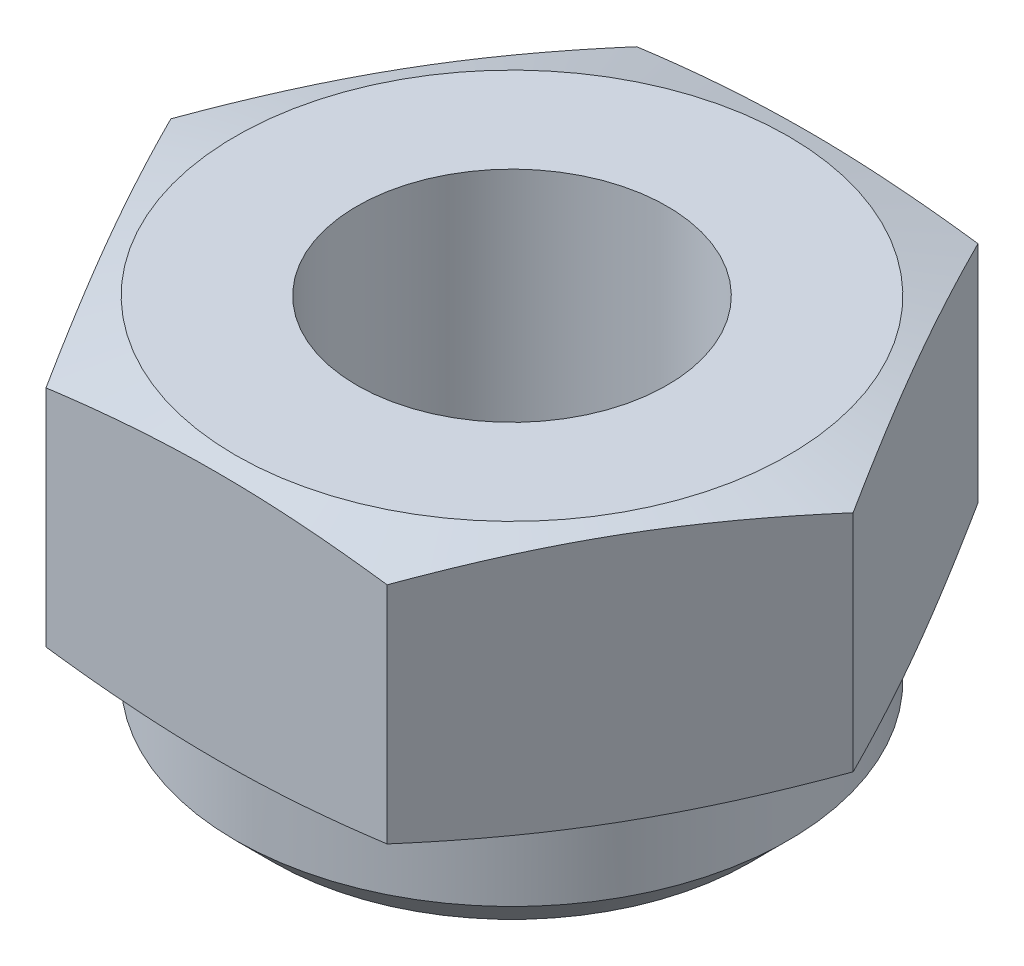
ISO-10303-21;
HEADER;
FILE_DESCRIPTION(('STEP AP214'),'2;1');
FILE_NAME('part.step','',(''),(''),'','','');
FILE_SCHEMA(('AUTOMOTIVE_DESIGN { 1 0 10303 214 1 1 1 1 }'));
ENDSEC;
DATA;
#1=APPLICATION_CONTEXT('core data for automotive mechanical design processes');
#2=APPLICATION_PROTOCOL_DEFINITION('international standard','automotive_design',2000,#1);
#3=PRODUCT_CONTEXT('',#1,'mechanical');
#4=PRODUCT('Part','Part','',(#3));
#5=PRODUCT_RELATED_PRODUCT_CATEGORY('part','',(#4));
#6=PRODUCT_DEFINITION_FORMATION('','',#4);
#7=PRODUCT_DEFINITION_CONTEXT('part definition',#1,'design');
#8=PRODUCT_DEFINITION('design','',#6,#7);
#9=PRODUCT_DEFINITION_SHAPE('','',#8);
#10=(LENGTH_UNIT() NAMED_UNIT(*) SI_UNIT(.MILLI.,.METRE.));
#11=(NAMED_UNIT(*) PLANE_ANGLE_UNIT() SI_UNIT($,.RADIAN.));
#12=(NAMED_UNIT(*) SI_UNIT($,.STERADIAN.) SOLID_ANGLE_UNIT());
#13=UNCERTAINTY_MEASURE_WITH_UNIT(LENGTH_MEASURE(1.E-05),#10,'distance_accuracy_value','');
#14=(GEOMETRIC_REPRESENTATION_CONTEXT(3) GLOBAL_UNCERTAINTY_ASSIGNED_CONTEXT((#13)) GLOBAL_UNIT_ASSIGNED_CONTEXT((#10,
#11,#12)) REPRESENTATION_CONTEXT('',''));
#15=CARTESIAN_POINT('',(0.,0.,0.));
#16=DIRECTION('',(0.,0.,1.));
#17=DIRECTION('',(1.,0.,0.));
#18=AXIS2_PLACEMENT_3D('',#15,#16,#17);
#19=CARTESIAN_POINT('',(0.,-3.22035730554475,0.));
#20=DIRECTION('',(0.,1.,0.));
#21=DIRECTION('',(0.,0.,1.));
#22=AXIS2_PLACEMENT_3D('',#19,#20,#21);
#23=CONICAL_SURFACE('',#22,4.55123435571671,1.30899693899575);
#24=CARTESIAN_POINT('',(0.,-3.453,0.));
#25=DIRECTION('',(0.,-1.,0.));
#26=DIRECTION('',(0.,0.,-1.));
#27=AXIS2_PLACEMENT_3D('',#24,#25,#26);
#28=CIRCLE('',#27,3.683);
#29=CARTESIAN_POINT('',(0.,-3.453,-3.68299999999999));
#30=VERTEX_POINT('',#29);
#31=EDGE_CURVE('E82',#30,#30,#28,.T.);
#32=ORIENTED_EDGE('',*,*,#31,.F.);
#33=EDGE_LOOP('',(#32));
#34=FACE_BOUND('',#33,.T.);
#35=CARTESIAN_POINT('',(-2.27302800979955,-3.2217448365256,-3.937));
#36=CARTESIAN_POINT('',(-2.36742116423181,-3.24704697845242,-3.77350626063663));
#37=CARTESIAN_POINT('',(-2.46198545378799,-3.27001707115095,-3.60971610654368));
#38=CARTESIAN_POINT('',(-2.65144796368359,-3.31037327653162,-3.28155741327498));
#39=CARTESIAN_POINT('',(-2.74634630386311,-3.32775712155993,-3.11718866653009));
#40=CARTESIAN_POINT('',(-2.93590160038181,-3.35592605718293,-2.78886926211592));
#41=CARTESIAN_POINT('',(-3.03055727520135,-3.3667447374092,-2.62492082410376));
#42=CARTESIAN_POINT('',(-3.2199893228459,-3.38125147171356,-2.29681489300159));
#43=CARTESIAN_POINT('',(-3.31476566877262,-3.38494090512249,-2.13265744650079));
#44=CARTESIAN_POINT('',(-3.50431836062605,-3.38494090512249,-1.8043425534992));
#45=CARTESIAN_POINT('',(-3.59909470655277,-3.38125147171356,-1.64018510699841));
#46=CARTESIAN_POINT('',(-3.78852675419732,-3.3667447374092,-1.31207917589623));
#47=CARTESIAN_POINT('',(-3.88318242901686,-3.35592605718293,-1.14813073788408));
#48=CARTESIAN_POINT('',(-4.07273772553556,-3.32775712155993,-0.8198113334699));
#49=CARTESIAN_POINT('',(-4.16763606571508,-3.31037327653162,-0.655442586725018));
#50=CARTESIAN_POINT('',(-4.35709857561068,-3.27001707115095,-0.327283893456316));
#51=CARTESIAN_POINT('',(-4.45166286516685,-3.24704697845242,-0.163493739363363));
#52=CARTESIAN_POINT('',(-4.54605601959911,-3.2217448365256,0.));
#53=B_SPLINE_CURVE_WITH_KNOTS('',3,(#35,#36,#37,#38,#39,#40,#41,#42,#43,#44,#45,#46,#47,#48,#49,
#50,#51,#52),.UNSPECIFIED.,.F.,.F.,(4,2,2,2,2,2,2,2,4),(0.,0.571452910592969,1.14313750178433,
1.71187194097368,2.28049633326033,2.84912072554698,3.41785516473633,3.98953975592769,
4.56099266652066),.UNSPECIFIED.);
#54=CARTESIAN_POINT('',(-2.27302800979955,-3.2217448365256,-3.937));
#55=VERTEX_POINT('',#54);
#56=CARTESIAN_POINT('',(-4.54605601959911,-3.2217448365256,0.));
#57=VERTEX_POINT('',#56);
#58=EDGE_CURVE('E105',#55,#57,#53,.T.);
#59=ORIENTED_EDGE('',*,*,#58,.F.);
#60=CARTESIAN_POINT('',(2.27302800979956,-3.22174483652559,-3.937));
#61=CARTESIAN_POINT('',(2.08424170093505,-3.24704697845242,-3.937));
#62=CARTESIAN_POINT('',(1.89511312182269,-3.27001707115095,-3.937));
#63=CARTESIAN_POINT('',(1.51618810203149,-3.31037327653162,-3.937));
#64=CARTESIAN_POINT('',(1.32639142167245,-3.32775712155993,-3.937));
#65=CARTESIAN_POINT('',(0.947280828635047,-3.35592605718293,-3.937));
#66=CARTESIAN_POINT('',(0.75796947899597,-3.3667447374092,-3.937));
#67=CARTESIAN_POINT('',(0.379105383706866,-3.38125147171356,-3.937));
#68=CARTESIAN_POINT('',(0.189552691853433,-3.38494090512249,-3.937));
#69=CARTESIAN_POINT('',(-0.189552691853431,-3.38494090512249,-3.937));
#70=CARTESIAN_POINT('',(-0.379105383706864,-3.38125147171356,-3.937));
#71=CARTESIAN_POINT('',(-0.757969478995967,-3.3667447374092,-3.937));
#72=CARTESIAN_POINT('',(-0.947280828635043,-3.35592605718293,-3.937));
#73=CARTESIAN_POINT('',(-1.32639142167245,-3.32775712155993,-3.937));
#74=CARTESIAN_POINT('',(-1.51618810203148,-3.31037327653162,-3.937));
#75=CARTESIAN_POINT('',(-1.89511312182269,-3.27001707115095,-3.937));
#76=CARTESIAN_POINT('',(-2.08424170093504,-3.24704697845242,-3.937));
#77=CARTESIAN_POINT('',(-2.27302800979955,-3.2217448365256,-3.937));
#78=B_SPLINE_CURVE_WITH_KNOTS('',3,(#60,#61,#62,#63,#64,#65,#66,#67,#68,#69,#70,#71,#72,#73,#74,
#75,#76,#77),.UNSPECIFIED.,.F.,.F.,(4,2,2,2,2,2,2,2,4),(0.,0.571452910592971,1.14313750178433,
1.71187194097368,2.28049633326034,2.84912072554699,3.41785516473634,3.9895397559277,
4.56099266652067),.UNSPECIFIED.);
#79=CARTESIAN_POINT('',(2.27302800979956,-3.22174483652559,-3.937));
#80=VERTEX_POINT('',#79);
#81=EDGE_CURVE('E109',#80,#55,#78,.T.);
#82=ORIENTED_EDGE('',*,*,#81,.F.);
#83=CARTESIAN_POINT('',(4.54605601959911,-3.2217448365256,0.));
#84=CARTESIAN_POINT('',(4.45166286516685,-3.24704697845242,-0.163493739363362));
#85=CARTESIAN_POINT('',(4.35709857561068,-3.27001707115095,-0.327283893456315));
#86=CARTESIAN_POINT('',(4.16763606571508,-3.31037327653162,-0.655442586725017));
#87=CARTESIAN_POINT('',(4.07273772553556,-3.32775712155993,-0.8198113334699));
#88=CARTESIAN_POINT('',(3.88318242901686,-3.35592605718293,-1.14813073788408));
#89=CARTESIAN_POINT('',(3.78852675419732,-3.3667447374092,-1.31207917589623));
#90=CARTESIAN_POINT('',(3.59909470655277,-3.38125147171356,-1.64018510699841));
#91=CARTESIAN_POINT('',(3.50431836062605,-3.38494090512249,-1.8043425534992));
#92=CARTESIAN_POINT('',(3.31476566877262,-3.38494090512249,-2.13265744650079));
#93=CARTESIAN_POINT('',(3.2199893228459,-3.38125147171356,-2.29681489300159));
#94=CARTESIAN_POINT('',(3.03055727520135,-3.3667447374092,-2.62492082410376));
#95=CARTESIAN_POINT('',(2.93590160038182,-3.35592605718293,-2.78886926211592));
#96=CARTESIAN_POINT('',(2.74634630386311,-3.32775712155993,-3.11718866653009));
#97=CARTESIAN_POINT('',(2.6514479636836,-3.31037327653162,-3.28155741327498));
#98=CARTESIAN_POINT('',(2.461985453788,-3.27001707115095,-3.60971610654368));
#99=CARTESIAN_POINT('',(2.36742116423182,-3.24704697845242,-3.77350626063663));
#100=CARTESIAN_POINT('',(2.27302800979956,-3.22174483652559,-3.937));
#101=B_SPLINE_CURVE_WITH_KNOTS('',3,(#83,#84,#85,#86,#87,#88,#89,#90,#91,#92,#93,#94,#95,#96,
#97,#98,#99,#100),.UNSPECIFIED.,.F.,.F.,(4,2,2,2,2,2,2,2,4),(0.,0.571452910592969,
1.14313750178433,1.71187194097368,2.28049633326033,2.84912072554698,3.41785516473633,
3.98953975592769,4.56099266652066),.UNSPECIFIED.);
#102=CARTESIAN_POINT('',(4.54605601959911,-3.2217448365256,0.));
#103=VERTEX_POINT('',#102);
#104=EDGE_CURVE('E88',#103,#80,#101,.T.);
#105=ORIENTED_EDGE('',*,*,#104,.F.);
#106=CARTESIAN_POINT('',(2.27302800979956,-3.2217448365256,3.937));
#107=CARTESIAN_POINT('',(2.36742116423182,-3.24704697845242,3.77350626063664));
#108=CARTESIAN_POINT('',(2.46198545378799,-3.27001707115095,3.60971610654368));
#109=CARTESIAN_POINT('',(2.65144796368359,-3.31037327653162,3.28155741327498));
#110=CARTESIAN_POINT('',(2.74634630386311,-3.32775712155993,3.1171886665301));
#111=CARTESIAN_POINT('',(2.93590160038181,-3.35592605718293,2.78886926211593));
#112=CARTESIAN_POINT('',(3.03055727520135,-3.3667447374092,2.62492082410377));
#113=CARTESIAN_POINT('',(3.2199893228459,-3.38125147171356,2.2968148930016));
#114=CARTESIAN_POINT('',(3.31476566877262,-3.38494090512249,2.1326574465008));
#115=CARTESIAN_POINT('',(3.50431836062605,-3.38494090512249,1.80434255349921));
#116=CARTESIAN_POINT('',(3.59909470655277,-3.38125147171356,1.64018510699841));
#117=CARTESIAN_POINT('',(3.78852675419732,-3.3667447374092,1.31207917589624));
#118=CARTESIAN_POINT('',(3.88318242901686,-3.35592605718293,1.14813073788408));
#119=CARTESIAN_POINT('',(4.07273772553556,-3.32775712155993,0.819811333469907));
#120=CARTESIAN_POINT('',(4.16763606571508,-3.31037327653162,0.655442586725025));
#121=CARTESIAN_POINT('',(4.35709857561068,-3.27001707115095,0.327283893456322));
#122=CARTESIAN_POINT('',(4.45166286516685,-3.24704697845242,0.163493739363369));
#123=CARTESIAN_POINT('',(4.54605601959911,-3.2217448365256,0.));
#124=B_SPLINE_CURVE_WITH_KNOTS('',3,(#106,#107,#108,#109,#110,#111,#112,#113,#114,#115,#116,
#117,#118,#119,#120,#121,#122,#123),.UNSPECIFIED.,.F.,.F.,(4,2,2,2,2,2,2,2,4),(0.,
0.571452910592969,1.14313750178433,1.71187194097368,2.28049633326033,2.84912072554698,
3.41785516473633,3.98953975592769,4.56099266652066),.UNSPECIFIED.);
#125=CARTESIAN_POINT('',(2.27302800979956,-3.2217448365256,3.937));
#126=VERTEX_POINT('',#125);
#127=EDGE_CURVE('E21',#126,#103,#124,.T.);
#128=ORIENTED_EDGE('',*,*,#127,.F.);
#129=CARTESIAN_POINT('',(-2.27302800979956,-3.2217448365256,3.937));
#130=CARTESIAN_POINT('',(-2.08424170093504,-3.24704697845242,3.937));
#131=CARTESIAN_POINT('',(-1.89511312182269,-3.27001707115095,3.937));
#132=CARTESIAN_POINT('',(-1.51618810203149,-3.31037327653162,3.937));
#133=CARTESIAN_POINT('',(-1.32639142167245,-3.32775712155993,3.937));
#134=CARTESIAN_POINT('',(-0.947280828635045,-3.35592605718293,3.937));
#135=CARTESIAN_POINT('',(-0.757969478995968,-3.3667447374092,3.937));
#136=CARTESIAN_POINT('',(-0.379105383706865,-3.38125147171356,3.937));
#137=CARTESIAN_POINT('',(-0.189552691853433,-3.38494090512249,3.937));
#138=CARTESIAN_POINT('',(0.189552691853432,-3.38494090512249,3.937));
#139=CARTESIAN_POINT('',(0.379105383706864,-3.38125147171356,3.937));
#140=CARTESIAN_POINT('',(0.757969478995968,-3.3667447374092,3.937));
#141=CARTESIAN_POINT('',(0.947280828635045,-3.35592605718293,3.937));
#142=CARTESIAN_POINT('',(1.32639142167245,-3.32775712155993,3.937));
#143=CARTESIAN_POINT('',(1.51618810203149,-3.31037327653162,3.937));
#144=CARTESIAN_POINT('',(1.89511312182269,-3.27001707115095,3.937));
#145=CARTESIAN_POINT('',(2.08424170093504,-3.24704697845242,3.937));
#146=CARTESIAN_POINT('',(2.27302800979956,-3.2217448365256,3.937));
#147=B_SPLINE_CURVE_WITH_KNOTS('',3,(#129,#130,#131,#132,#133,#134,#135,#136,#137,#138,#139,
#140,#141,#142,#143,#144,#145,#146),.UNSPECIFIED.,.F.,.F.,(4,2,2,2,2,2,2,2,4),(0.,
0.57145291059297,1.14313750178433,1.71187194097368,2.28049633326033,2.84912072554698,
3.41785516473634,3.9895397559277,4.56099266652067),.UNSPECIFIED.);
#148=CARTESIAN_POINT('',(-2.27302800979956,-3.2217448365256,3.937));
#149=VERTEX_POINT('',#148);
#150=EDGE_CURVE('E72',#149,#126,#147,.T.);
#151=ORIENTED_EDGE('',*,*,#150,.F.);
#152=CARTESIAN_POINT('',(-4.54605601959911,-3.2217448365256,0.));
#153=CARTESIAN_POINT('',(-4.45166286516686,-3.24704697845242,0.163493739363369));
#154=CARTESIAN_POINT('',(-4.35709857561068,-3.27001707115095,0.327283893456322));
#155=CARTESIAN_POINT('',(-4.16763606571508,-3.31037327653162,0.655442586725024));
#156=CARTESIAN_POINT('',(-4.07273772553556,-3.32775712155993,0.819811333469906));
#157=CARTESIAN_POINT('',(-3.88318242901686,-3.35592605718293,1.14813073788408));
#158=CARTESIAN_POINT('',(-3.78852675419732,-3.3667447374092,1.31207917589624));
#159=CARTESIAN_POINT('',(-3.59909470655277,-3.38125147171356,1.64018510699841));
#160=CARTESIAN_POINT('',(-3.50431836062605,-3.38494090512249,1.80434255349921));
#161=CARTESIAN_POINT('',(-3.31476566877262,-3.38494090512249,2.1326574465008));
#162=CARTESIAN_POINT('',(-3.2199893228459,-3.38125147171356,2.2968148930016));
#163=CARTESIAN_POINT('',(-3.03055727520135,-3.3667447374092,2.62492082410377));
#164=CARTESIAN_POINT('',(-2.93590160038181,-3.35592605718293,2.78886926211593));
#165=CARTESIAN_POINT('',(-2.74634630386311,-3.32775712155993,3.1171886665301));
#166=CARTESIAN_POINT('',(-2.65144796368359,-3.31037327653162,3.28155741327498));
#167=CARTESIAN_POINT('',(-2.46198545378799,-3.27001707115095,3.60971610654368));
#168=CARTESIAN_POINT('',(-2.36742116423181,-3.24704697845242,3.77350626063664));
#169=CARTESIAN_POINT('',(-2.27302800979956,-3.2217448365256,3.937));
#170=B_SPLINE_CURVE_WITH_KNOTS('',3,(#152,#153,#154,#155,#156,#157,#158,#159,#160,#161,#162,
#163,#164,#165,#166,#167,#168,#169),.UNSPECIFIED.,.F.,.F.,(4,2,2,2,2,2,2,2,4),(0.,
0.571452910592969,1.14313750178433,1.71187194097368,2.28049633326033,2.84912072554698,
3.41785516473633,3.98953975592769,4.56099266652066),.UNSPECIFIED.);
#171=EDGE_CURVE('E98',#57,#149,#170,.T.);
#172=ORIENTED_EDGE('',*,*,#171,.F.);
#173=EDGE_LOOP('',(#59,#82,#105,#128,#151,#172));
#174=FACE_BOUND('',#173,.T.);
#175=ADVANCED_FACE('F17',(#34,#174),#23,.T.);
#176=CARTESIAN_POINT('',(2.27302800979956,-4.953,3.937));
#177=DIRECTION('',(0.866025403784439,0.,0.499999999999999));
#178=DIRECTION('',(0.499999999999999,0.,-0.866025403784439));
#179=AXIS2_PLACEMENT_3D('',#176,#177,#178);
#180=PLANE('',#179);
#181=CARTESIAN_POINT('',(2.27302798691892,-0.231255169599825,3.93700003963043));
#182=CARTESIAN_POINT('',(2.3674211402546,-0.205953027587978,3.7735063021664));
#183=CARTESIAN_POINT('',(2.46198542870934,-0.182982934708705,3.60971614998118));
#184=CARTESIAN_POINT('',(2.65144793639823,-0.142626728752802,3.28155746053461));
#185=CARTESIAN_POINT('',(2.74634627547247,-0.12524288332993,3.11718871570413));
#186=CARTESIAN_POINT('',(2.93590156979769,-0.0970739466832135,2.78886931508919));
#187=CARTESIAN_POINT('',(3.03055724352903,-0.0862552658296005,2.62492087896183));
#188=CARTESIAN_POINT('',(3.21998928900921,-0.0717485300531823,2.29681495160846));
#189=CARTESIAN_POINT('',(3.31476563385975,-0.0680590957996024,2.13265750697166));
#190=CARTESIAN_POINT('',(3.50431832359237,-0.0680590939432748,1.80434261764342));
#191=CARTESIAN_POINT('',(3.59909466847445,-0.0717485263415443,1.64018517295199));
#192=CARTESIAN_POINT('',(3.7885267140491,-0.0862552585319696,1.31207924543499));
#193=CARTESIAN_POINT('',(3.88318238784338,-0.0970739376548731,1.14813080919863));
#194=CARTESIAN_POINT('',(4.07273768231352,-0.125242871043363,0.819811408332677));
#195=CARTESIAN_POINT('',(4.16763602146985,-0.142626714939716,0.655442663360006));
#196=CARTESIAN_POINT('',(4.35709852933456,-0.182982918081933,0.327283973608905));
#197=CARTESIAN_POINT('',(4.45166281788302,-0.205953009674135,0.163493821261367));
#198=CARTESIAN_POINT('',(4.54605597131061,-0.231255150530112,8.36381373183971E-08));
#199=B_SPLINE_CURVE_WITH_KNOTS('',3,(#181,#182,#183,#184,#185,#186,#187,#188,#189,#190,#191,
#192,#193,#194,#195,#196,#197,#198),.UNSPECIFIED.,.F.,.F.,(4,2,2,2,2,2,2,2,4),(0.,
0.571452904104339,1.14313748880532,1.7118719215906,2.28049630747671,2.84912069344121,
3.41785512630083,3.98953971106748,4.56099261525712),.UNSPECIFIED.);
#200=CARTESIAN_POINT('',(2.27302796148131,-0.231255156995559,3.937));
#201=VERTEX_POINT('',#200);
#202=CARTESIAN_POINT('',(4.54605599545448,-0.231255156999442,4.18197292350811E-08));
#203=VERTEX_POINT('',#202);
#204=EDGE_CURVE('E93',#201,#203,#199,.T.);
#205=ORIENTED_EDGE('',*,*,#204,.F.);
#206=DIRECTION('',(0.,1.,0.));
#207=VECTOR('',#206,1.);
#208=CARTESIAN_POINT('',(2.27302800979956,-4.953,3.937));
#209=LINE('',#208,#207);
#210=EDGE_CURVE('E77',#126,#201,#209,.T.);
#211=ORIENTED_EDGE('',*,*,#210,.F.);
#212=ORIENTED_EDGE('',*,*,#127,.T.);
#213=DIRECTION('',(0.,1.,0.));
#214=VECTOR('',#213,1.);
#215=CARTESIAN_POINT('',(4.54605601959911,-4.953,0.));
#216=LINE('',#215,#214);
#217=EDGE_CURVE('E110',#203,#103,#216,.F.);
#218=ORIENTED_EDGE('',*,*,#217,.F.);
#219=EDGE_LOOP('',(#205,#211,#212,#218));
#220=FACE_BOUND('',#219,.T.);
#221=ADVANCED_FACE('F92',(#220),#180,.T.);
#222=CARTESIAN_POINT('',(4.54605601959911,-4.953,0.));
#223=DIRECTION('',(0.866025403784439,0.,-0.499999999999999));
#224=DIRECTION('',(-0.499999999999999,0.,-0.866025403784439));
#225=AXIS2_PLACEMENT_3D('',#222,#223,#224);
#226=PLANE('',#225);
#227=CARTESIAN_POINT('',(4.54605604247459,-0.231255169598442,3.96214944871014E-08));
#228=CARTESIAN_POINT('',(4.45166288913996,-0.205953027586963,-0.163493697840718));
#229=CARTESIAN_POINT('',(4.35709860068627,-0.182982934708014,-0.327283850024111));
#230=CARTESIAN_POINT('',(4.1676360929995,-0.142626728752641,-0.655442539467011));
#231=CARTESIAN_POINT('',(4.07273775392633,-0.125242883329976,-0.819811284295649));
#232=CARTESIAN_POINT('',(3.88318245960322,-0.0970739466835187,-1.14813068490693));
#233=CARTESIAN_POINT('',(3.78852678587293,-0.0862552658299611,-1.31207912103246));
#234=CARTESIAN_POINT('',(3.59909474039486,-0.071748530053487,-1.64018504838219));
#235=CARTESIAN_POINT('',(3.50431839554537,-0.068059095799796,-1.80434249301717));
#236=CARTESIAN_POINT('',(3.31476570581485,-0.0680590939430812,-2.13265738234176));
#237=CARTESIAN_POINT('',(3.21998936093382,-0.0717485263410751,-2.29681482703139));
#238=CARTESIAN_POINT('',(3.03055731536126,-0.0862552585308086,-2.62492075454477));
#239=CARTESIAN_POINT('',(2.93590164156802,-0.0970739376532962,-2.78886919077932));
#240=CARTESIAN_POINT('',(2.74634634709997,-0.125242871040847,-3.11718859164167));
#241=CARTESIAN_POINT('',(2.65144800794468,-0.142626714936675,-3.28155733661253));
#242=CARTESIAN_POINT('',(2.46198550008205,-0.182982918077776,-3.60971602636003));
#243=CARTESIAN_POINT('',(2.36742121153462,-0.205953009669385,-3.77350617870577));
#244=CARTESIAN_POINT('',(2.27302805810806,-0.231255150524753,-3.93699991632722));
#245=B_SPLINE_CURVE_WITH_KNOTS('',3,(#227,#228,#229,#230,#231,#232,#233,#234,#235,#236,#237,
#238,#239,#240,#241,#242,#243,#244),.UNSPECIFIED.,.F.,.F.,(4,2,2,2,2,2,2,2,4),(0.,
0.571452904097947,1.14313748879253,1.71187192157149,2.28049630745129,2.84912069340951,
3.41785512626283,3.98953971102309,4.56099261520636),.UNSPECIFIED.);
#246=CARTESIAN_POINT('',(2.27302803395381,-0.231255156996865,-3.93699995816361));
#247=VERTEX_POINT('',#246);
#248=EDGE_CURVE('E190',#203,#247,#245,.T.);
#249=ORIENTED_EDGE('',*,*,#248,.F.);
#250=ORIENTED_EDGE('',*,*,#217,.T.);
#251=ORIENTED_EDGE('',*,*,#104,.T.);
#252=DIRECTION('',(0.,1.,0.));
#253=VECTOR('',#252,1.);
#254=CARTESIAN_POINT('',(2.27302800979956,-4.953,-3.937));
#255=LINE('',#254,#253);
#256=EDGE_CURVE('E106',#247,#80,#255,.F.);
#257=ORIENTED_EDGE('',*,*,#256,.F.);
#258=EDGE_LOOP('',(#249,#250,#251,#257));
#259=FACE_BOUND('',#258,.T.);
#260=ADVANCED_FACE('F195',(#259),#226,.T.);
#261=CARTESIAN_POINT('',(2.27302800979956,-4.953,-3.937));
#262=DIRECTION('',(0.,0.,-1.));
#263=DIRECTION('',(-1.,0.,0.));
#264=AXIS2_PLACEMENT_3D('',#261,#262,#263);
#265=PLANE('',#264);
#266=ORIENTED_EDGE('',*,*,#256,.T.);
#267=ORIENTED_EDGE('',*,*,#81,.T.);
#268=DIRECTION('',(0.,1.,0.));
#269=VECTOR('',#268,1.);
#270=CARTESIAN_POINT('',(-2.27302800979955,-4.953,-3.937));
#271=LINE('',#270,#269);
#272=CARTESIAN_POINT('',(-2.27302796148194,-0.231255156995643,-3.937));
#273=VERTEX_POINT('',#272);
#274=EDGE_CURVE('E102',#273,#55,#271,.F.);
#275=ORIENTED_EDGE('',*,*,#274,.F.);
#276=CARTESIAN_POINT('',(2.27302805554133,-0.231255169597212,-3.937));
#277=CARTESIAN_POINT('',(2.08424174290425,-0.20595302678314,-3.93700000000118));
#278=CARTESIAN_POINT('',(1.89511316000505,-0.182982933252794,-3.93700000000059));
#279=CARTESIAN_POINT('',(1.51618813260676,-0.142626726377202,-3.93699999999941));
#280=CARTESIAN_POINT('',(1.32639144842745,-0.125242880685982,-3.93699999999881));
#281=CARTESIAN_POINT('',(0.947280847754391,-0.0970739439694403,-3.93700000000117));
#282=CARTESIAN_POINT('',(0.757969494300103,-0.0862552633109423,-3.9370000000041));
#283=CARTESIAN_POINT('',(0.379105391365754,-0.0717485284336597,-3.93699999999589));
#284=CARTESIAN_POINT('',(0.189552695682294,-0.0680590948839046,-3.93699999998475));
#285=CARTESIAN_POINT('',(-0.189552683776927,-0.0680590948823656,-3.93699999998475));
#286=CARTESIAN_POINT('',(-0.379105367552687,-0.0717485279671321,-3.93699999999589));
#287=CARTESIAN_POINT('',(-0.757969446715473,-0.0862552610431552,-3.9370000000041));
#288=CARTESIAN_POINT('',(-0.947280788305919,-0.0970739403649571,-3.93700000000117));
#289=CARTESIAN_POINT('',(-1.32639136521005,-0.12524287368538,-3.93699999999881));
#290=CARTESIAN_POINT('',(-1.51618803748488,-0.142626717311309,-3.93699999999941));
#291=CARTESIAN_POINT('',(-1.89511304118042,-0.182982919529432,-3.93700000000059));
#292=CARTESIAN_POINT('',(-2.08424161228126,-0.205953010468246,-3.93700000000118));
#293=CARTESIAN_POINT('',(-2.27302791316432,-0.23125515052231,-3.937));
#294=B_SPLINE_CURVE_WITH_KNOTS('',3,(#276,#277,#278,#279,#280,#281,#282,#283,#284,#285,#286,
#287,#288,#289,#290,#291,#292,#293),.UNSPECIFIED.,.F.,.F.,(4,2,2,2,2,2,2,2,4),(0.,
0.571452922166741,1.14313752494876,1.71187197563215,2.28049637940514,2.84912074746415,
3.41785516240618,3.98953972907054,4.56099261517826),.UNSPECIFIED.);
#295=EDGE_CURVE('E186',#247,#273,#294,.T.);
#296=ORIENTED_EDGE('',*,*,#295,.F.);
#297=EDGE_LOOP('',(#266,#267,#275,#296));
#298=FACE_BOUND('',#297,.T.);
#299=ADVANCED_FACE('F177',(#298),#265,.T.);
#300=CARTESIAN_POINT('',(-2.27302800979955,-4.953,-3.937));
#301=DIRECTION('',(-0.866025403784439,0.,-0.5));
#302=DIRECTION('',(-0.5,0.,0.866025403784439));
#303=AXIS2_PLACEMENT_3D('',#300,#301,#302);
#304=PLANE('',#303);
#305=CARTESIAN_POINT('',(-2.27302798691955,-0.231255169599654,-3.93700003962932));
#306=CARTESIAN_POINT('',(-2.3674211402543,-0.205953027588066,-3.7735063021669));
#307=CARTESIAN_POINT('',(-2.46198542870812,-0.182982934709008,-3.60971614998329));
#308=CARTESIAN_POINT('',(-2.65144793639514,-0.142626728753416,-3.28155746053996));
#309=CARTESIAN_POINT('',(-2.74634627546844,-0.125242883330642,-3.11718871571111));
#310=CARTESIAN_POINT('',(-2.93590156979179,-0.0970739466839748,-2.78886931509939));
#311=CARTESIAN_POINT('',(-3.03055724352221,-0.0862552658303155,-2.62492087897365));
#312=CARTESIAN_POINT('',(-3.21998928900053,-0.0717485300536518,-2.29681495162349));
#313=CARTESIAN_POINT('',(-3.31476563385015,-0.0680590957998729,-2.13265750698829));
#314=CARTESIAN_POINT('',(-3.50431832358092,-0.0680590939430021,-1.80434261766325));
#315=CARTESIAN_POINT('',(-3.59909466846208,-0.0717485263409278,-1.6401851729734));
#316=CARTESIAN_POINT('',(-3.78852671403491,-0.086255258530549,-1.31207924545957));
#317=CARTESIAN_POINT('',(-3.88318238782827,-0.0970739376529923,-1.14813080922479));
#318=CARTESIAN_POINT('',(-4.07273768229659,-0.125242871040479,-0.819811408361994));
#319=CARTESIAN_POINT('',(-4.16763602145201,-0.142626714936288,-0.655442663390905));
#320=CARTESIAN_POINT('',(-4.3570985293149,-0.18298291807737,-0.327283973642951));
#321=CARTESIAN_POINT('',(-4.45166281786246,-0.205953009668981,-0.163493821296978));
#322=CARTESIAN_POINT('',(-4.54605597128915,-0.23125515052436,-8.36753081664675E-08));
#323=B_SPLINE_CURVE_WITH_KNOTS('',3,(#305,#306,#307,#308,#309,#310,#311,#312,#313,#314,#315,
#316,#317,#318,#319,#320,#321,#322),.UNSPECIFIED.,.F.,.F.,(4,2,2,2,2,2,2,2,4),(0.,
0.57145290409872,1.14313748879408,1.7118719215738,2.28049630745437,2.84912069341335,
3.41785512626745,3.98953971102849,4.56099261521254),.UNSPECIFIED.);
#324=CARTESIAN_POINT('',(-4.54605599544413,-0.231255156996668,-4.18376520402527E-08));
#325=VERTEX_POINT('',#324);
#326=EDGE_CURVE('E181',#273,#325,#323,.T.);
#327=ORIENTED_EDGE('',*,*,#326,.F.);
#328=ORIENTED_EDGE('',*,*,#274,.T.);
#329=ORIENTED_EDGE('',*,*,#58,.T.);
#330=DIRECTION('',(0.,1.,0.));
#331=VECTOR('',#330,1.);
#332=CARTESIAN_POINT('',(-4.54605601959911,-4.953,0.));
#333=LINE('',#332,#331);
#334=EDGE_CURVE('E94',#325,#57,#333,.F.);
#335=ORIENTED_EDGE('',*,*,#334,.F.);
#336=EDGE_LOOP('',(#327,#328,#329,#335));
#337=FACE_BOUND('',#336,.T.);
#338=ADVANCED_FACE('F174',(#337),#304,.T.);
#339=CARTESIAN_POINT('',(-4.54605601959911,-4.953,0.));
#340=DIRECTION('',(-0.866025403784439,0.,0.5));
#341=DIRECTION('',(0.5,0.,0.866025403784439));
#342=AXIS2_PLACEMENT_3D('',#339,#340,#341);
#343=PLANE('',#342);
#344=CARTESIAN_POINT('',(-4.54605604247146,-0.231255169597603,-3.96160681526264E-08));
#345=CARTESIAN_POINT('',(-4.45166288913672,-0.205953027586144,0.16349369784635));
#346=CARTESIAN_POINT('',(-4.3570986006829,-0.182982934707227,0.32728385002995));
#347=CARTESIAN_POINT('',(-4.16763609299589,-0.142626728751942,0.655442539473265));
#348=CARTESIAN_POINT('',(-4.0727377539226,-0.125242883329333,0.81981128430211));
#349=CARTESIAN_POINT('',(-3.88318245959926,-0.0970739466830166,1.14813068491381));
#350=CARTESIAN_POINT('',(-3.78852678586885,-0.0862552658295426,1.31207912103954));
#351=CARTESIAN_POINT('',(-3.59909474039054,-0.0717485300532604,1.64018504838967));
#352=CARTESIAN_POINT('',(-3.50431839554094,-0.0680590957996777,1.80434249302485));
#353=CARTESIAN_POINT('',(-3.31476570581019,-0.0680590939431978,2.13265738234984));
#354=CARTESIAN_POINT('',(-3.21998936092904,-0.071748526341318,2.29681482703966));
#355=CARTESIAN_POINT('',(-3.03055731535626,-0.0862552585313126,2.62492075455343));
#356=CARTESIAN_POINT('',(-2.93590164156291,-0.0970739376539349,2.78886919078817));
#357=CARTESIAN_POINT('',(-2.74634634709464,-0.125242871041757,3.1171885916509));
#358=CARTESIAN_POINT('',(-2.65144800793924,-0.142626714937722,3.28155733662195));
#359=CARTESIAN_POINT('',(-2.46198550007639,-0.18298291807909,3.60971602636982));
#360=CARTESIAN_POINT('',(-2.36742121152886,-0.20595300967083,3.77350617871576));
#361=CARTESIAN_POINT('',(-2.27302805810219,-0.231255150526325,3.93699991633739));
#362=B_SPLINE_CURVE_WITH_KNOTS('',3,(#344,#345,#346,#347,#348,#349,#350,#351,#352,#353,#354,
#355,#356,#357,#358,#359,#360,#361),.UNSPECIFIED.,.F.,.F.,(4,2,2,2,2,2,2,2,4),(0.,
0.571452904098646,1.14313748879393,1.71187192157358,2.28049630745407,2.84912069341297,
3.41785512626698,3.98953971102792,4.56099261521189),.UNSPECIFIED.);
#363=CARTESIAN_POINT('',(-2.27302803395087,-0.23125515699765,3.93699995816869));
#364=VERTEX_POINT('',#363);
#365=EDGE_CURVE('E40',#325,#364,#362,.T.);
#366=ORIENTED_EDGE('',*,*,#365,.F.);
#367=ORIENTED_EDGE('',*,*,#334,.T.);
#368=ORIENTED_EDGE('',*,*,#171,.T.);
#369=DIRECTION('',(0.,1.,0.));
#370=VECTOR('',#369,1.);
#371=CARTESIAN_POINT('',(-2.27302800979956,-4.953,3.937));
#372=LINE('',#371,#370);
#373=EDGE_CURVE('E79',#364,#149,#372,.F.);
#374=ORIENTED_EDGE('',*,*,#373,.F.);
#375=EDGE_LOOP('',(#366,#367,#368,#374));
#376=FACE_BOUND('',#375,.T.);
#377=ADVANCED_FACE('F142',(#376),#343,.T.);
#378=CARTESIAN_POINT('',(-2.27302800979956,-4.953,3.937));
#379=DIRECTION('',(0.,0.,1.));
#380=DIRECTION('',(1.,0.,0.));
#381=AXIS2_PLACEMENT_3D('',#378,#379,#380);
#382=PLANE('',#381);
#383=ORIENTED_EDGE('',*,*,#373,.T.);
#384=ORIENTED_EDGE('',*,*,#150,.T.);
#385=ORIENTED_EDGE('',*,*,#210,.T.);
#386=CARTESIAN_POINT('',(-2.2730280555296,-0.23125516959564,3.937));
#387=CARTESIAN_POINT('',(-2.08424174289363,-0.205953026782723,3.937));
#388=CARTESIAN_POINT('',(-1.89511315999558,-0.182982933252155,3.937));
#389=CARTESIAN_POINT('',(-1.5161881325993,-0.142626726376037,3.937));
#390=CARTESIAN_POINT('',(-1.32639144842086,-0.12524288068452,3.937));
#391=CARTESIAN_POINT('',(-0.947280847749753,-0.0970739439700641,3.937));
#392=CARTESIAN_POINT('',(-0.757969494296548,-0.0862552633139278,3.937));
#393=CARTESIAN_POINT('',(-0.379105391364629,-0.0717485284304964,3.937));
#394=CARTESIAN_POINT('',(-0.189552695682515,-0.0680590948722277,3.937));
#395=CARTESIAN_POINT('',(0.18955268377515,-0.0680590948706485,3.937));
#396=CARTESIAN_POINT('',(0.3791053675507,-0.0717485279639326,3.937));
#397=CARTESIAN_POINT('',(0.757969446713327,-0.0862552610461981,3.937));
#398=CARTESIAN_POINT('',(0.947280788303822,-0.0970739403657283,3.937));
#399=CARTESIAN_POINT('',(1.32639136520828,-0.125242873684318,3.937));
#400=CARTESIAN_POINT('',(1.51618803748337,-0.142626717310708,3.937));
#401=CARTESIAN_POINT('',(1.89511304117917,-0.18298291952974,3.937));
#402=CARTESIAN_POINT('',(2.08424161227999,-0.205953010468995,3.937));
#403=CARTESIAN_POINT('',(2.27302791316306,-0.231255150522141,3.937));
#404=B_SPLINE_CURVE_WITH_KNOTS('',3,(#386,#387,#388,#389,#390,#391,#392,#393,#394,#395,#396,
#397,#398,#399,#400,#401,#402,#403),.UNSPECIFIED.,.F.,.F.,(4,2,2,2,2,2,2,2,4),(0.,
0.571452922163274,1.14313752494267,1.71187197562272,2.28049637939196,2.84912074745062,
3.41785516239273,3.9895397290579,4.56099261516559),.UNSPECIFIED.);
#405=EDGE_CURVE('E123',#364,#201,#404,.T.);
#406=ORIENTED_EDGE('',*,*,#405,.F.);
#407=EDGE_LOOP('',(#383,#384,#385,#406));
#408=FACE_BOUND('',#407,.T.);
#409=ADVANCED_FACE('F74',(#408),#382,.T.);
#410=CARTESIAN_POINT('',(0.,-60.,0.));
#411=DIRECTION('',(0.,-1.,0.));
#412=DIRECTION('',(0.,0.,-1.));
#413=AXIS2_PLACEMENT_3D('',#410,#411,#412);
#414=CYLINDRICAL_SURFACE('',#413,3.683);
#415=ORIENTED_EDGE('',*,*,#31,.T.);
#416=EDGE_LOOP('',(#415));
#417=FACE_BOUND('',#416,.T.);
#418=CARTESIAN_POINT('',(0.,-4.44500000003245,0.));
#419=DIRECTION('',(0.,1.,0.));
#420=DIRECTION('',(0.,0.,1.));
#421=AXIS2_PLACEMENT_3D('',#418,#419,#420);
#422=CIRCLE('',#421,3.68299999996679);
#423=CARTESIAN_POINT('',(0.,-4.44500000003245,3.6829999999668));
#424=VERTEX_POINT('',#423);
#425=EDGE_CURVE('E122',#424,#424,#422,.F.);
#426=ORIENTED_EDGE('',*,*,#425,.F.);
#427=EDGE_LOOP('',(#426));
#428=FACE_BOUND('',#427,.T.);
#429=ADVANCED_FACE('F141',(#417,#428),#414,.T.);
#430=CARTESIAN_POINT('',(0.,-0.23264269444212,0.));
#431=DIRECTION('',(0.,-1.,0.));
#432=DIRECTION('',(0.,0.,-1.));
#433=AXIS2_PLACEMENT_3D('',#430,#431,#432);
#434=CONICAL_SURFACE('',#433,4.55123435568794,1.30899693899476);
#435=CARTESIAN_POINT('',(0.,0.,0.));
#436=DIRECTION('',(0.,-1.,0.));
#437=DIRECTION('',(0.,0.,-1.));
#438=AXIS2_PLACEMENT_3D('',#435,#436,#437);
#439=CIRCLE('',#438,3.68300000002364);
#440=CARTESIAN_POINT('',(0.,0.,-3.68300000002364));
#441=VERTEX_POINT('',#440);
#442=EDGE_CURVE('E119',#441,#441,#439,.F.);
#443=ORIENTED_EDGE('',*,*,#442,.F.);
#444=EDGE_LOOP('',(#443));
#445=FACE_BOUND('',#444,.T.);
#446=ORIENTED_EDGE('',*,*,#365,.T.);
#447=ORIENTED_EDGE('',*,*,#405,.T.);
#448=ORIENTED_EDGE('',*,*,#204,.T.);
#449=ORIENTED_EDGE('',*,*,#248,.T.);
#450=ORIENTED_EDGE('',*,*,#295,.T.);
#451=ORIENTED_EDGE('',*,*,#326,.T.);
#452=EDGE_LOOP('',(#446,#447,#448,#449,#450,#451));
#453=FACE_BOUND('',#452,.T.);
#454=ADVANCED_FACE('F135',(#445,#453),#434,.T.);
#455=CARTESIAN_POINT('',(0.,-4.44499999997561,0.));
#456=DIRECTION('',(0.,1.,0.));
#457=DIRECTION('',(0.,0.,1.));
#458=AXIS2_PLACEMENT_3D('',#455,#456,#457);
#459=CONICAL_SURFACE('',#458,3.68300000008048,0.785398163397448);
#460=CARTESIAN_POINT('',(0.,-4.95299999994359,0.));
#461=DIRECTION('',(0.,1.,0.));
#462=DIRECTION('',(0.,0.,1.));
#463=AXIS2_PLACEMENT_3D('',#460,#461,#462);
#464=CIRCLE('',#463,3.1750000001125);
#465=CARTESIAN_POINT('',(0.,-4.95299999994359,3.1750000001125));
#466=VERTEX_POINT('',#465);
#467=EDGE_CURVE('E116',#466,#466,#464,.T.);
#468=ORIENTED_EDGE('',*,*,#467,.T.);
#469=EDGE_LOOP('',(#468));
#470=FACE_BOUND('',#469,.T.);
#471=ORIENTED_EDGE('',*,*,#425,.T.);
#472=EDGE_LOOP('',(#471));
#473=FACE_BOUND('',#472,.T.);
#474=ADVANCED_FACE('F211',(#470,#473),#459,.T.);
#475=CARTESIAN_POINT('',(-2.27302800979956,0.,3.937));
#476=DIRECTION('',(0.,1.,0.));
#477=DIRECTION('',(0.,0.,1.));
#478=AXIS2_PLACEMENT_3D('',#475,#476,#477);
#479=PLANE('',#478);
#480=CARTESIAN_POINT('',(0.,0.,0.));
#481=DIRECTION('',(0.,1.,0.));
#482=DIRECTION('',(0.,0.,1.));
#483=AXIS2_PLACEMENT_3D('',#480,#481,#482);
#484=CIRCLE('',#483,2.067);
#485=CARTESIAN_POINT('',(0.,0.,2.067));
#486=VERTEX_POINT('',#485);
#487=EDGE_CURVE('E31',#486,#486,#484,.F.);
#488=ORIENTED_EDGE('',*,*,#487,.T.);
#489=EDGE_LOOP('',(#488));
#490=FACE_BOUND('',#489,.T.);
#491=ORIENTED_EDGE('',*,*,#442,.T.);
#492=EDGE_LOOP('',(#491));
#493=FACE_BOUND('',#492,.T.);
#494=ADVANCED_FACE('F218',(#490,#493),#479,.T.);
#495=CARTESIAN_POINT('',(-2.27302800979956,-4.953,3.937));
#496=DIRECTION('',(0.,1.,0.));
#497=DIRECTION('',(0.,0.,1.));
#498=AXIS2_PLACEMENT_3D('',#495,#496,#497);
#499=PLANE('',#498);
#500=CARTESIAN_POINT('',(0.,-4.953,0.));
#501=DIRECTION('',(0.,1.,0.));
#502=DIRECTION('',(0.,0.,1.));
#503=AXIS2_PLACEMENT_3D('',#500,#501,#502);
#504=CIRCLE('',#503,2.067);
#505=CARTESIAN_POINT('',(0.,-4.953,2.067));
#506=VERTEX_POINT('',#505);
#507=EDGE_CURVE('E11',#506,#506,#504,.T.);
#508=ORIENTED_EDGE('',*,*,#507,.T.);
#509=EDGE_LOOP('',(#508));
#510=FACE_BOUND('',#509,.T.);
#511=ORIENTED_EDGE('',*,*,#467,.F.);
#512=EDGE_LOOP('',(#511));
#513=FACE_BOUND('',#512,.T.);
#514=ADVANCED_FACE('F224',(#510,#513),#499,.F.);
#515=CARTESIAN_POINT('',(0.,-4.953,0.));
#516=DIRECTION('',(0.,1.,0.));
#517=DIRECTION('',(0.,0.,1.));
#518=AXIS2_PLACEMENT_3D('',#515,#516,#517);
#519=CYLINDRICAL_SURFACE('',#518,2.067);
#520=ORIENTED_EDGE('',*,*,#487,.F.);
#521=EDGE_LOOP('',(#520));
#522=FACE_BOUND('',#521,.T.);
#523=ORIENTED_EDGE('',*,*,#507,.F.);
#524=EDGE_LOOP('',(#523));
#525=FACE_BOUND('',#524,.T.);
#526=ADVANCED_FACE('F222',(#522,#525),#519,.F.);
#527=CLOSED_SHELL('',(#175,#221,#260,#299,#338,#377,#409,#429,#454,#474,#494,#514,#526));
#528=MANIFOLD_SOLID_BREP('B1',#527);
#529=ADVANCED_BREP_SHAPE_REPRESENTATION('',(#18,#528),#14);
#530=SHAPE_DEFINITION_REPRESENTATION(#9,#529);
ENDSEC;
END-ISO-10303-21;
